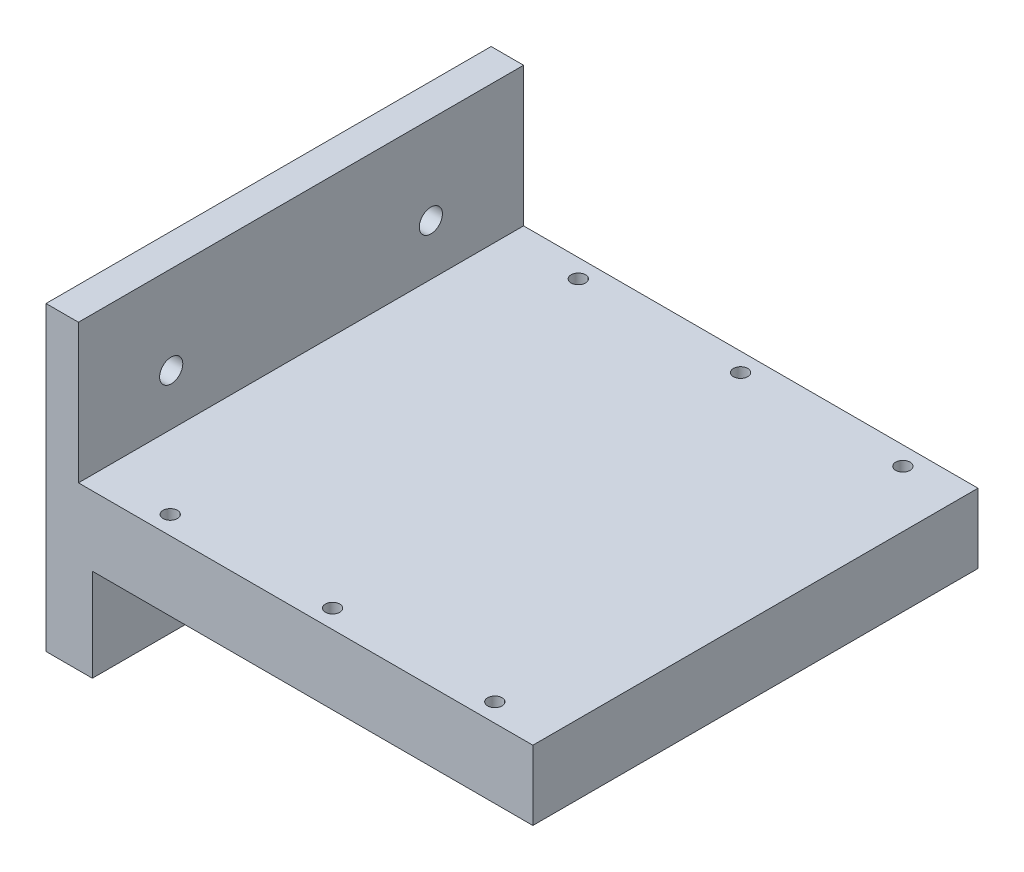
ISO-10303-21;
HEADER;
FILE_DESCRIPTION(('STEP AP214'),'2;1');
FILE_NAME('part.step','',(''),(''),'','','');
FILE_SCHEMA(('AUTOMOTIVE_DESIGN { 1 0 10303 214 1 1 1 1 }'));
ENDSEC;
DATA;
#1=APPLICATION_CONTEXT('core data for automotive mechanical design processes');
#2=APPLICATION_PROTOCOL_DEFINITION('international standard','automotive_design',2000,#1);
#3=PRODUCT_CONTEXT('',#1,'mechanical');
#4=PRODUCT('Part','Part','',(#3));
#5=PRODUCT_RELATED_PRODUCT_CATEGORY('part','',(#4));
#6=PRODUCT_DEFINITION_FORMATION('','',#4);
#7=PRODUCT_DEFINITION_CONTEXT('part definition',#1,'design');
#8=PRODUCT_DEFINITION('design','',#6,#7);
#9=PRODUCT_DEFINITION_SHAPE('','',#8);
#10=(LENGTH_UNIT() NAMED_UNIT(*) SI_UNIT(.MILLI.,.METRE.));
#11=(NAMED_UNIT(*) PLANE_ANGLE_UNIT() SI_UNIT($,.RADIAN.));
#12=(NAMED_UNIT(*) SI_UNIT($,.STERADIAN.) SOLID_ANGLE_UNIT());
#13=UNCERTAINTY_MEASURE_WITH_UNIT(LENGTH_MEASURE(1.E-05),#10,'distance_accuracy_value','');
#14=(GEOMETRIC_REPRESENTATION_CONTEXT(3) GLOBAL_UNCERTAINTY_ASSIGNED_CONTEXT((#13)) GLOBAL_UNIT_ASSIGNED_CONTEXT((#10,
#11,#12)) REPRESENTATION_CONTEXT('',''));
#15=CARTESIAN_POINT('',(0.,0.,0.));
#16=DIRECTION('',(0.,0.,1.));
#17=DIRECTION('',(1.,0.,0.));
#18=AXIS2_PLACEMENT_3D('',#15,#16,#17);
#19=CARTESIAN_POINT('',(-52.5,-7.5,96.));
#20=DIRECTION('',(0.,1.,0.));
#21=DIRECTION('',(0.,0.,1.));
#22=AXIS2_PLACEMENT_3D('',#19,#20,#21);
#23=PLANE('',#22);
#24=CARTESIAN_POINT('',(-29.7,-7.5,4.));
#25=DIRECTION('',(0.,1.,0.));
#26=DIRECTION('',(0.,0.,1.));
#27=AXIS2_PLACEMENT_3D('',#24,#25,#26);
#28=CIRCLE('',#27,1.55);
#29=CARTESIAN_POINT('',(-29.7,-7.5,5.55));
#30=VERTEX_POINT('',#29);
#31=EDGE_CURVE('E141',#30,#30,#28,.T.);
#32=ORIENTED_EDGE('',*,*,#31,.T.);
#33=EDGE_LOOP('',(#32));
#34=FACE_BOUND('',#33,.T.);
#35=CARTESIAN_POINT('',(5.29999999999999,-7.5,92.));
#36=DIRECTION('',(0.,1.,0.));
#37=DIRECTION('',(0.,0.,1.));
#38=AXIS2_PLACEMENT_3D('',#35,#36,#37);
#39=CIRCLE('',#38,1.55);
#40=CARTESIAN_POINT('',(5.29999999999999,-7.5,93.55));
#41=VERTEX_POINT('',#40);
#42=EDGE_CURVE('E274',#41,#41,#39,.T.);
#43=ORIENTED_EDGE('',*,*,#42,.T.);
#44=EDGE_LOOP('',(#43));
#45=FACE_BOUND('',#44,.T.);
#46=CARTESIAN_POINT('',(5.29999999999999,-7.5,4.));
#47=DIRECTION('',(0.,1.,0.));
#48=DIRECTION('',(0.,0.,1.));
#49=AXIS2_PLACEMENT_3D('',#46,#47,#48);
#50=CIRCLE('',#49,1.55);
#51=CARTESIAN_POINT('',(5.29999999999999,-7.5,5.55));
#52=VERTEX_POINT('',#51);
#53=EDGE_CURVE('E271',#52,#52,#50,.T.);
#54=ORIENTED_EDGE('',*,*,#53,.T.);
#55=EDGE_LOOP('',(#54));
#56=FACE_BOUND('',#55,.T.);
#57=CARTESIAN_POINT('',(40.3,-7.5,4.));
#58=DIRECTION('',(0.,1.,0.));
#59=DIRECTION('',(0.,0.,1.));
#60=AXIS2_PLACEMENT_3D('',#57,#58,#59);
#61=CIRCLE('',#60,1.55);
#62=CARTESIAN_POINT('',(40.3,-7.5,5.55));
#63=VERTEX_POINT('',#62);
#64=EDGE_CURVE('E267',#63,#63,#61,.T.);
#65=ORIENTED_EDGE('',*,*,#64,.T.);
#66=EDGE_LOOP('',(#65));
#67=FACE_BOUND('',#66,.T.);
#68=CARTESIAN_POINT('',(-29.7,-7.5,92.));
#69=DIRECTION('',(0.,1.,0.));
#70=DIRECTION('',(0.,0.,1.));
#71=AXIS2_PLACEMENT_3D('',#68,#69,#70);
#72=CIRCLE('',#71,1.55);
#73=CARTESIAN_POINT('',(-29.7,-7.5,93.55));
#74=VERTEX_POINT('',#73);
#75=EDGE_CURVE('E263',#74,#74,#72,.T.);
#76=ORIENTED_EDGE('',*,*,#75,.T.);
#77=EDGE_LOOP('',(#76));
#78=FACE_BOUND('',#77,.T.);
#79=CARTESIAN_POINT('',(40.3,-7.5,92.));
#80=DIRECTION('',(0.,1.,0.));
#81=DIRECTION('',(0.,0.,1.));
#82=AXIS2_PLACEMENT_3D('',#79,#80,#81);
#83=CIRCLE('',#82,1.55);
#84=CARTESIAN_POINT('',(40.3,-7.5,93.55));
#85=VERTEX_POINT('',#84);
#86=EDGE_CURVE('E259',#85,#85,#83,.T.);
#87=ORIENTED_EDGE('',*,*,#86,.T.);
#88=EDGE_LOOP('',(#87));
#89=FACE_BOUND('',#88,.T.);
#90=DIRECTION('',(0.,0.,1.));
#91=VECTOR('',#90,1.);
#92=CARTESIAN_POINT('',(-42.5,-7.5,96.));
#93=LINE('',#92,#91);
#94=CARTESIAN_POINT('',(-42.5,-7.5,0.));
#95=VERTEX_POINT('',#94);
#96=CARTESIAN_POINT('',(-42.5,-7.5,96.));
#97=VERTEX_POINT('',#96);
#98=EDGE_CURVE('E60',#95,#97,#93,.T.);
#99=ORIENTED_EDGE('',*,*,#98,.F.);
#100=DIRECTION('',(1.,0.,0.));
#101=VECTOR('',#100,1.);
#102=CARTESIAN_POINT('',(-52.5,-7.5,0.));
#103=LINE('',#102,#101);
#104=CARTESIAN_POINT('',(52.5,-7.5,0.));
#105=VERTEX_POINT('',#104);
#106=EDGE_CURVE('E120',#95,#105,#103,.T.);
#107=ORIENTED_EDGE('',*,*,#106,.T.);
#108=DIRECTION('',(0.,0.,-1.));
#109=VECTOR('',#108,1.);
#110=CARTESIAN_POINT('',(52.5,-7.5,96.));
#111=LINE('',#110,#109);
#112=CARTESIAN_POINT('',(52.5,-7.5,96.));
#113=VERTEX_POINT('',#112);
#114=EDGE_CURVE('E52',#113,#105,#111,.T.);
#115=ORIENTED_EDGE('',*,*,#114,.F.);
#116=DIRECTION('',(1.,0.,0.));
#117=VECTOR('',#116,1.);
#118=CARTESIAN_POINT('',(-52.5,-7.5,96.));
#119=LINE('',#118,#117);
#120=EDGE_CURVE('E189',#97,#113,#119,.T.);
#121=ORIENTED_EDGE('',*,*,#120,.F.);
#122=EDGE_LOOP('',(#99,#107,#115,#121));
#123=FACE_BOUND('',#122,.T.);
#124=ADVANCED_FACE('F42',(#34,#45,#56,#67,#78,#89,#123),#23,.F.);
#125=CARTESIAN_POINT('',(-52.5,7.5,96.));
#126=DIRECTION('',(0.,-1.,0.));
#127=DIRECTION('',(0.,0.,-1.));
#128=AXIS2_PLACEMENT_3D('',#125,#126,#127);
#129=PLANE('',#128);
#130=CARTESIAN_POINT('',(-29.7,7.5,4.));
#131=DIRECTION('',(0.,1.,0.));
#132=DIRECTION('',(0.,0.,1.));
#133=AXIS2_PLACEMENT_3D('',#130,#131,#132);
#134=CIRCLE('',#133,1.55);
#135=CARTESIAN_POINT('',(-29.7,7.5,5.55));
#136=VERTEX_POINT('',#135);
#137=EDGE_CURVE('E239',#136,#136,#134,.T.);
#138=ORIENTED_EDGE('',*,*,#137,.F.);
#139=EDGE_LOOP('',(#138));
#140=FACE_BOUND('',#139,.T.);
#141=CARTESIAN_POINT('',(5.29999999999999,7.5,92.));
#142=DIRECTION('',(0.,1.,0.));
#143=DIRECTION('',(0.,0.,1.));
#144=AXIS2_PLACEMENT_3D('',#141,#142,#143);
#145=CIRCLE('',#144,1.55);
#146=CARTESIAN_POINT('',(5.29999999999999,7.5,93.55));
#147=VERTEX_POINT('',#146);
#148=EDGE_CURVE('E240',#147,#147,#145,.T.);
#149=ORIENTED_EDGE('',*,*,#148,.F.);
#150=EDGE_LOOP('',(#149));
#151=FACE_BOUND('',#150,.T.);
#152=CARTESIAN_POINT('',(5.29999999999999,7.5,4.));
#153=DIRECTION('',(0.,1.,0.));
#154=DIRECTION('',(0.,0.,1.));
#155=AXIS2_PLACEMENT_3D('',#152,#153,#154);
#156=CIRCLE('',#155,1.55);
#157=CARTESIAN_POINT('',(5.29999999999999,7.5,5.55));
#158=VERTEX_POINT('',#157);
#159=EDGE_CURVE('E244',#158,#158,#156,.T.);
#160=ORIENTED_EDGE('',*,*,#159,.F.);
#161=EDGE_LOOP('',(#160));
#162=FACE_BOUND('',#161,.T.);
#163=CARTESIAN_POINT('',(40.3,7.5,4.));
#164=DIRECTION('',(0.,1.,0.));
#165=DIRECTION('',(0.,0.,1.));
#166=AXIS2_PLACEMENT_3D('',#163,#164,#165);
#167=CIRCLE('',#166,1.55);
#168=CARTESIAN_POINT('',(40.3,7.5,5.55));
#169=VERTEX_POINT('',#168);
#170=EDGE_CURVE('E248',#169,#169,#167,.T.);
#171=ORIENTED_EDGE('',*,*,#170,.F.);
#172=EDGE_LOOP('',(#171));
#173=FACE_BOUND('',#172,.T.);
#174=CARTESIAN_POINT('',(-29.7,7.5,92.));
#175=DIRECTION('',(0.,1.,0.));
#176=DIRECTION('',(0.,0.,1.));
#177=AXIS2_PLACEMENT_3D('',#174,#175,#176);
#178=CIRCLE('',#177,1.55);
#179=CARTESIAN_POINT('',(-29.7,7.5,93.55));
#180=VERTEX_POINT('',#179);
#181=EDGE_CURVE('E235',#180,#180,#178,.T.);
#182=ORIENTED_EDGE('',*,*,#181,.F.);
#183=EDGE_LOOP('',(#182));
#184=FACE_BOUND('',#183,.T.);
#185=CARTESIAN_POINT('',(40.3,7.5,92.));
#186=DIRECTION('',(0.,1.,0.));
#187=DIRECTION('',(0.,0.,1.));
#188=AXIS2_PLACEMENT_3D('',#185,#186,#187);
#189=CIRCLE('',#188,1.55);
#190=CARTESIAN_POINT('',(40.3,7.5,93.55));
#191=VERTEX_POINT('',#190);
#192=EDGE_CURVE('E252',#191,#191,#189,.T.);
#193=ORIENTED_EDGE('',*,*,#192,.F.);
#194=EDGE_LOOP('',(#193));
#195=FACE_BOUND('',#194,.T.);
#196=DIRECTION('',(0.,0.,-1.));
#197=VECTOR('',#196,1.);
#198=CARTESIAN_POINT('',(-45.5,7.5,0.));
#199=LINE('',#198,#197);
#200=CARTESIAN_POINT('',(-45.5,7.5,96.));
#201=VERTEX_POINT('',#200);
#202=CARTESIAN_POINT('',(-45.5,7.5,0.));
#203=VERTEX_POINT('',#202);
#204=EDGE_CURVE('E68',#201,#203,#199,.T.);
#205=ORIENTED_EDGE('',*,*,#204,.F.);
#206=DIRECTION('',(-1.,0.,0.));
#207=VECTOR('',#206,1.);
#208=CARTESIAN_POINT('',(-52.5,7.5,96.));
#209=LINE('',#208,#207);
#210=CARTESIAN_POINT('',(52.5,7.5,96.));
#211=VERTEX_POINT('',#210);
#212=EDGE_CURVE('E183',#211,#201,#209,.T.);
#213=ORIENTED_EDGE('',*,*,#212,.F.);
#214=DIRECTION('',(0.,0.,-1.));
#215=VECTOR('',#214,1.);
#216=CARTESIAN_POINT('',(52.5,7.5,96.));
#217=LINE('',#216,#215);
#218=CARTESIAN_POINT('',(52.5,7.5,0.));
#219=VERTEX_POINT('',#218);
#220=EDGE_CURVE('E11',#211,#219,#217,.T.);
#221=ORIENTED_EDGE('',*,*,#220,.T.);
#222=DIRECTION('',(-1.,0.,0.));
#223=VECTOR('',#222,1.);
#224=CARTESIAN_POINT('',(-52.5,7.5,0.));
#225=LINE('',#224,#223);
#226=EDGE_CURVE('E121',#219,#203,#225,.T.);
#227=ORIENTED_EDGE('',*,*,#226,.T.);
#228=EDGE_LOOP('',(#205,#213,#221,#227));
#229=FACE_BOUND('',#228,.T.);
#230=ADVANCED_FACE('F302',(#140,#151,#162,#173,#184,#195,#229),#129,.F.);
#231=CARTESIAN_POINT('',(52.5,-7.5,96.));
#232=DIRECTION('',(-1.,0.,0.));
#233=DIRECTION('',(0.,0.,1.));
#234=AXIS2_PLACEMENT_3D('',#231,#232,#233);
#235=PLANE('',#234);
#236=DIRECTION('',(0.,1.,0.));
#237=VECTOR('',#236,1.);
#238=CARTESIAN_POINT('',(52.5,-7.5,0.));
#239=LINE('',#238,#237);
#240=EDGE_CURVE('E178',#105,#219,#239,.T.);
#241=ORIENTED_EDGE('',*,*,#240,.T.);
#242=ORIENTED_EDGE('',*,*,#220,.F.);
#243=DIRECTION('',(0.,1.,0.));
#244=VECTOR('',#243,1.);
#245=CARTESIAN_POINT('',(52.5,-7.5,96.));
#246=LINE('',#245,#244);
#247=EDGE_CURVE('E179',#113,#211,#246,.T.);
#248=ORIENTED_EDGE('',*,*,#247,.F.);
#249=ORIENTED_EDGE('',*,*,#114,.T.);
#250=EDGE_LOOP('',(#241,#242,#248,#249));
#251=FACE_BOUND('',#250,.T.);
#252=ADVANCED_FACE('F44',(#251),#235,.F.);
#253=CARTESIAN_POINT('',(-52.5,-7.5,96.));
#254=DIRECTION('',(1.,0.,0.));
#255=DIRECTION('',(0.,0.,-1.));
#256=AXIS2_PLACEMENT_3D('',#253,#254,#255);
#257=PLANE('',#256);
#258=CARTESIAN_POINT('',(-52.5,18.5,76.));
#259=DIRECTION('',(1.,0.,0.));
#260=DIRECTION('',(0.,0.,-1.));
#261=AXIS2_PLACEMENT_3D('',#258,#259,#260);
#262=CIRCLE('',#261,2.50000000000001);
#263=CARTESIAN_POINT('',(-52.5,18.5,73.5));
#264=VERTEX_POINT('',#263);
#265=EDGE_CURVE('E214',#264,#264,#262,.F.);
#266=ORIENTED_EDGE('',*,*,#265,.F.);
#267=EDGE_LOOP('',(#266));
#268=FACE_BOUND('',#267,.T.);
#269=CARTESIAN_POINT('',(-52.5,18.5,20.));
#270=DIRECTION('',(1.,0.,0.));
#271=DIRECTION('',(0.,0.,-1.));
#272=AXIS2_PLACEMENT_3D('',#269,#270,#271);
#273=CIRCLE('',#272,2.5);
#274=CARTESIAN_POINT('',(-52.5,18.5,17.5));
#275=VERTEX_POINT('',#274);
#276=EDGE_CURVE('E204',#275,#275,#273,.F.);
#277=ORIENTED_EDGE('',*,*,#276,.F.);
#278=EDGE_LOOP('',(#277));
#279=FACE_BOUND('',#278,.T.);
#280=CARTESIAN_POINT('',(-52.5,-19.5,76.));
#281=DIRECTION('',(1.,0.,0.));
#282=DIRECTION('',(0.,0.,-1.));
#283=AXIS2_PLACEMENT_3D('',#280,#281,#282);
#284=CIRCLE('',#283,2.50000000000001);
#285=CARTESIAN_POINT('',(-52.5,-19.5,73.5));
#286=VERTEX_POINT('',#285);
#287=EDGE_CURVE('E231',#286,#286,#284,.T.);
#288=ORIENTED_EDGE('',*,*,#287,.T.);
#289=EDGE_LOOP('',(#288));
#290=FACE_BOUND('',#289,.T.);
#291=CARTESIAN_POINT('',(-52.5,-19.5,20.));
#292=DIRECTION('',(1.,0.,0.));
#293=DIRECTION('',(0.,0.,-1.));
#294=AXIS2_PLACEMENT_3D('',#291,#292,#293);
#295=CIRCLE('',#294,2.5);
#296=CARTESIAN_POINT('',(-52.5,-19.5,17.5));
#297=VERTEX_POINT('',#296);
#298=EDGE_CURVE('E224',#297,#297,#295,.T.);
#299=ORIENTED_EDGE('',*,*,#298,.T.);
#300=EDGE_LOOP('',(#299));
#301=FACE_BOUND('',#300,.T.);
#302=DIRECTION('',(0.,-1.,0.));
#303=VECTOR('',#302,1.);
#304=CARTESIAN_POINT('',(-52.5,-7.5,0.));
#305=LINE('',#304,#303);
#306=CARTESIAN_POINT('',(-52.5,37.5,0.));
#307=VERTEX_POINT('',#306);
#308=CARTESIAN_POINT('',(-52.5,-27.5,0.));
#309=VERTEX_POINT('',#308);
#310=EDGE_CURVE('E110',#307,#309,#305,.T.);
#311=ORIENTED_EDGE('',*,*,#310,.T.);
#312=DIRECTION('',(0.,0.,-1.));
#313=VECTOR('',#312,1.);
#314=CARTESIAN_POINT('',(-52.5,-27.5,96.));
#315=LINE('',#314,#313);
#316=CARTESIAN_POINT('',(-52.5,-27.5,96.));
#317=VERTEX_POINT('',#316);
#318=EDGE_CURVE('E114',#317,#309,#315,.T.);
#319=ORIENTED_EDGE('',*,*,#318,.F.);
#320=DIRECTION('',(0.,-1.,0.));
#321=VECTOR('',#320,1.);
#322=CARTESIAN_POINT('',(-52.5,-7.5,96.));
#323=LINE('',#322,#321);
#324=CARTESIAN_POINT('',(-52.5,37.5,96.));
#325=VERTEX_POINT('',#324);
#326=EDGE_CURVE('E186',#325,#317,#323,.T.);
#327=ORIENTED_EDGE('',*,*,#326,.F.);
#328=DIRECTION('',(0.,0.,1.));
#329=VECTOR('',#328,1.);
#330=CARTESIAN_POINT('',(-52.5,37.5,0.));
#331=LINE('',#330,#329);
#332=EDGE_CURVE('E116',#307,#325,#331,.T.);
#333=ORIENTED_EDGE('',*,*,#332,.F.);
#334=EDGE_LOOP('',(#311,#319,#327,#333));
#335=FACE_BOUND('',#334,.T.);
#336=ADVANCED_FACE('F112',(#268,#279,#290,#301,#335),#257,.F.);
#337=CARTESIAN_POINT('',(0.,0.,96.));
#338=DIRECTION('',(0.,0.,-1.));
#339=DIRECTION('',(-1.,0.,0.));
#340=AXIS2_PLACEMENT_3D('',#337,#338,#339);
#341=PLANE('',#340);
#342=ORIENTED_EDGE('',*,*,#247,.T.);
#343=ORIENTED_EDGE('',*,*,#212,.T.);
#344=DIRECTION('',(0.,-1.,0.));
#345=VECTOR('',#344,1.);
#346=CARTESIAN_POINT('',(-45.5,37.5,96.));
#347=LINE('',#346,#345);
#348=CARTESIAN_POINT('',(-45.5,37.5,96.));
#349=VERTEX_POINT('',#348);
#350=EDGE_CURVE('E168',#349,#201,#347,.T.);
#351=ORIENTED_EDGE('',*,*,#350,.F.);
#352=DIRECTION('',(1.,0.,0.));
#353=VECTOR('',#352,1.);
#354=CARTESIAN_POINT('',(-45.5,37.5,96.));
#355=LINE('',#354,#353);
#356=EDGE_CURVE('E165',#325,#349,#355,.T.);
#357=ORIENTED_EDGE('',*,*,#356,.F.);
#358=ORIENTED_EDGE('',*,*,#326,.T.);
#359=DIRECTION('',(-1.,0.,0.));
#360=VECTOR('',#359,1.);
#361=CARTESIAN_POINT('',(-52.5,-27.5,96.));
#362=LINE('',#361,#360);
#363=CARTESIAN_POINT('',(-42.5,-27.5,96.));
#364=VERTEX_POINT('',#363);
#365=EDGE_CURVE('E137',#364,#317,#362,.T.);
#366=ORIENTED_EDGE('',*,*,#365,.F.);
#367=DIRECTION('',(0.,1.,0.));
#368=VECTOR('',#367,1.);
#369=CARTESIAN_POINT('',(-42.5,-27.5,96.));
#370=LINE('',#369,#368);
#371=EDGE_CURVE('E149',#364,#97,#370,.T.);
#372=ORIENTED_EDGE('',*,*,#371,.T.);
#373=ORIENTED_EDGE('',*,*,#120,.T.);
#374=EDGE_LOOP('',(#342,#343,#351,#357,#358,#366,#372,#373));
#375=FACE_BOUND('',#374,.T.);
#376=ADVANCED_FACE('F312',(#375),#341,.F.);
#377=CARTESIAN_POINT('',(0.,0.,0.));
#378=DIRECTION('',(0.,0.,-1.));
#379=DIRECTION('',(-1.,0.,0.));
#380=AXIS2_PLACEMENT_3D('',#377,#378,#379);
#381=PLANE('',#380);
#382=ORIENTED_EDGE('',*,*,#240,.F.);
#383=ORIENTED_EDGE('',*,*,#106,.F.);
#384=DIRECTION('',(0.,1.,0.));
#385=VECTOR('',#384,1.);
#386=CARTESIAN_POINT('',(-42.5,-27.5,0.));
#387=LINE('',#386,#385);
#388=CARTESIAN_POINT('',(-42.5,-27.5,0.));
#389=VERTEX_POINT('',#388);
#390=EDGE_CURVE('E128',#389,#95,#387,.T.);
#391=ORIENTED_EDGE('',*,*,#390,.F.);
#392=DIRECTION('',(1.,0.,0.));
#393=VECTOR('',#392,1.);
#394=CARTESIAN_POINT('',(-52.5,-27.5,0.));
#395=LINE('',#394,#393);
#396=EDGE_CURVE('E124',#309,#389,#395,.T.);
#397=ORIENTED_EDGE('',*,*,#396,.F.);
#398=ORIENTED_EDGE('',*,*,#310,.F.);
#399=DIRECTION('',(-1.,0.,0.));
#400=VECTOR('',#399,1.);
#401=CARTESIAN_POINT('',(-45.5,37.5,0.));
#402=LINE('',#401,#400);
#403=CARTESIAN_POINT('',(-45.5,37.5,0.));
#404=VERTEX_POINT('',#403);
#405=EDGE_CURVE('E160',#404,#307,#402,.T.);
#406=ORIENTED_EDGE('',*,*,#405,.F.);
#407=DIRECTION('',(0.,-1.,0.));
#408=VECTOR('',#407,1.);
#409=CARTESIAN_POINT('',(-45.5,37.5,0.));
#410=LINE('',#409,#408);
#411=EDGE_CURVE('E174',#404,#203,#410,.T.);
#412=ORIENTED_EDGE('',*,*,#411,.T.);
#413=ORIENTED_EDGE('',*,*,#226,.F.);
#414=EDGE_LOOP('',(#382,#383,#391,#397,#398,#406,#412,#413));
#415=FACE_BOUND('',#414,.T.);
#416=ADVANCED_FACE('F126',(#415),#381,.T.);
#417=CARTESIAN_POINT('',(-45.5,37.5,0.));
#418=DIRECTION('',(-1.,0.,0.));
#419=DIRECTION('',(0.,0.,1.));
#420=AXIS2_PLACEMENT_3D('',#417,#418,#419);
#421=PLANE('',#420);
#422=CARTESIAN_POINT('',(-45.5,18.5,76.));
#423=DIRECTION('',(-1.,0.,0.));
#424=DIRECTION('',(0.,0.,1.));
#425=AXIS2_PLACEMENT_3D('',#422,#423,#424);
#426=CIRCLE('',#425,2.50000000000001);
#427=CARTESIAN_POINT('',(-45.5,18.5,78.5));
#428=VERTEX_POINT('',#427);
#429=EDGE_CURVE('E46',#428,#428,#426,.F.);
#430=ORIENTED_EDGE('',*,*,#429,.F.);
#431=EDGE_LOOP('',(#430));
#432=FACE_BOUND('',#431,.T.);
#433=CARTESIAN_POINT('',(-45.5,18.5,20.));
#434=DIRECTION('',(-1.,0.,0.));
#435=DIRECTION('',(0.,0.,1.));
#436=AXIS2_PLACEMENT_3D('',#433,#434,#435);
#437=CIRCLE('',#436,2.5);
#438=CARTESIAN_POINT('',(-45.5,18.5,22.5));
#439=VERTEX_POINT('',#438);
#440=EDGE_CURVE('E201',#439,#439,#437,.F.);
#441=ORIENTED_EDGE('',*,*,#440,.F.);
#442=EDGE_LOOP('',(#441));
#443=FACE_BOUND('',#442,.T.);
#444=ORIENTED_EDGE('',*,*,#204,.T.);
#445=ORIENTED_EDGE('',*,*,#411,.F.);
#446=DIRECTION('',(0.,0.,-1.));
#447=VECTOR('',#446,1.);
#448=CARTESIAN_POINT('',(-45.5,37.5,0.));
#449=LINE('',#448,#447);
#450=EDGE_CURVE('E156',#349,#404,#449,.T.);
#451=ORIENTED_EDGE('',*,*,#450,.F.);
#452=ORIENTED_EDGE('',*,*,#350,.T.);
#453=EDGE_LOOP('',(#444,#445,#451,#452));
#454=FACE_BOUND('',#453,.T.);
#455=ADVANCED_FACE('F374',(#432,#443,#454),#421,.F.);
#456=CARTESIAN_POINT('',(0.,37.5,0.));
#457=DIRECTION('',(0.,-1.,0.));
#458=DIRECTION('',(0.,0.,-1.));
#459=AXIS2_PLACEMENT_3D('',#456,#457,#458);
#460=PLANE('',#459);
#461=ORIENTED_EDGE('',*,*,#450,.T.);
#462=ORIENTED_EDGE('',*,*,#405,.T.);
#463=ORIENTED_EDGE('',*,*,#332,.T.);
#464=ORIENTED_EDGE('',*,*,#356,.T.);
#465=EDGE_LOOP('',(#461,#462,#463,#464));
#466=FACE_BOUND('',#465,.T.);
#467=ADVANCED_FACE('F370',(#466),#460,.F.);
#468=CARTESIAN_POINT('',(-42.5,-27.5,96.));
#469=DIRECTION('',(-1.,0.,0.));
#470=DIRECTION('',(0.,0.,1.));
#471=AXIS2_PLACEMENT_3D('',#468,#469,#470);
#472=PLANE('',#471);
#473=CARTESIAN_POINT('',(-42.5,-19.5,76.));
#474=DIRECTION('',(1.,0.,0.));
#475=DIRECTION('',(0.,0.,-1.));
#476=AXIS2_PLACEMENT_3D('',#473,#474,#475);
#477=CIRCLE('',#476,2.50000000000001);
#478=CARTESIAN_POINT('',(-42.5,-19.5,73.5));
#479=VERTEX_POINT('',#478);
#480=EDGE_CURVE('E220',#479,#479,#477,.T.);
#481=ORIENTED_EDGE('',*,*,#480,.F.);
#482=EDGE_LOOP('',(#481));
#483=FACE_BOUND('',#482,.T.);
#484=CARTESIAN_POINT('',(-42.5,-19.5,20.));
#485=DIRECTION('',(1.,0.,0.));
#486=DIRECTION('',(0.,0.,-1.));
#487=AXIS2_PLACEMENT_3D('',#484,#485,#486);
#488=CIRCLE('',#487,2.5);
#489=CARTESIAN_POINT('',(-42.5,-19.5,17.5));
#490=VERTEX_POINT('',#489);
#491=EDGE_CURVE('E219',#490,#490,#488,.T.);
#492=ORIENTED_EDGE('',*,*,#491,.F.);
#493=EDGE_LOOP('',(#492));
#494=FACE_BOUND('',#493,.T.);
#495=ORIENTED_EDGE('',*,*,#98,.T.);
#496=ORIENTED_EDGE('',*,*,#371,.F.);
#497=DIRECTION('',(0.,0.,1.));
#498=VECTOR('',#497,1.);
#499=CARTESIAN_POINT('',(-42.5,-27.5,96.));
#500=LINE('',#499,#498);
#501=EDGE_CURVE('E132',#389,#364,#500,.T.);
#502=ORIENTED_EDGE('',*,*,#501,.F.);
#503=ORIENTED_EDGE('',*,*,#390,.T.);
#504=EDGE_LOOP('',(#495,#496,#502,#503));
#505=FACE_BOUND('',#504,.T.);
#506=ADVANCED_FACE('F364',(#483,#494,#505),#472,.F.);
#507=CARTESIAN_POINT('',(0.,-27.5,0.));
#508=DIRECTION('',(0.,-1.,0.));
#509=DIRECTION('',(0.,0.,-1.));
#510=AXIS2_PLACEMENT_3D('',#507,#508,#509);
#511=PLANE('',#510);
#512=ORIENTED_EDGE('',*,*,#318,.T.);
#513=ORIENTED_EDGE('',*,*,#396,.T.);
#514=ORIENTED_EDGE('',*,*,#501,.T.);
#515=ORIENTED_EDGE('',*,*,#365,.T.);
#516=EDGE_LOOP('',(#512,#513,#514,#515));
#517=FACE_BOUND('',#516,.T.);
#518=ADVANCED_FACE('F135',(#517),#511,.T.);
#519=CARTESIAN_POINT('',(40.3,-12.5,92.));
#520=DIRECTION('',(0.,1.,0.));
#521=DIRECTION('',(0.,0.,1.));
#522=AXIS2_PLACEMENT_3D('',#519,#520,#521);
#523=CYLINDRICAL_SURFACE('',#522,1.55);
#524=ORIENTED_EDGE('',*,*,#192,.T.);
#525=EDGE_LOOP('',(#524));
#526=FACE_BOUND('',#525,.T.);
#527=ORIENTED_EDGE('',*,*,#86,.F.);
#528=EDGE_LOOP('',(#527));
#529=FACE_BOUND('',#528,.T.);
#530=ADVANCED_FACE('F342',(#526,#529),#523,.F.);
#531=CARTESIAN_POINT('',(-29.7,-12.5,92.));
#532=DIRECTION('',(0.,1.,0.));
#533=DIRECTION('',(0.,0.,1.));
#534=AXIS2_PLACEMENT_3D('',#531,#532,#533);
#535=CYLINDRICAL_SURFACE('',#534,1.55);
#536=ORIENTED_EDGE('',*,*,#181,.T.);
#537=EDGE_LOOP('',(#536));
#538=FACE_BOUND('',#537,.T.);
#539=ORIENTED_EDGE('',*,*,#75,.F.);
#540=EDGE_LOOP('',(#539));
#541=FACE_BOUND('',#540,.T.);
#542=ADVANCED_FACE('F339',(#538,#541),#535,.F.);
#543=CARTESIAN_POINT('',(40.3,-12.5,4.));
#544=DIRECTION('',(0.,1.,0.));
#545=DIRECTION('',(0.,0.,1.));
#546=AXIS2_PLACEMENT_3D('',#543,#544,#545);
#547=CYLINDRICAL_SURFACE('',#546,1.55);
#548=ORIENTED_EDGE('',*,*,#170,.T.);
#549=EDGE_LOOP('',(#548));
#550=FACE_BOUND('',#549,.T.);
#551=ORIENTED_EDGE('',*,*,#64,.F.);
#552=EDGE_LOOP('',(#551));
#553=FACE_BOUND('',#552,.T.);
#554=ADVANCED_FACE('F341',(#550,#553),#547,.F.);
#555=CARTESIAN_POINT('',(5.29999999999999,-12.5,4.));
#556=DIRECTION('',(0.,1.,0.));
#557=DIRECTION('',(0.,0.,1.));
#558=AXIS2_PLACEMENT_3D('',#555,#556,#557);
#559=CYLINDRICAL_SURFACE('',#558,1.55);
#560=ORIENTED_EDGE('',*,*,#159,.T.);
#561=EDGE_LOOP('',(#560));
#562=FACE_BOUND('',#561,.T.);
#563=ORIENTED_EDGE('',*,*,#53,.F.);
#564=EDGE_LOOP('',(#563));
#565=FACE_BOUND('',#564,.T.);
#566=ADVANCED_FACE('F297',(#562,#565),#559,.F.);
#567=CARTESIAN_POINT('',(5.29999999999999,-12.5,92.));
#568=DIRECTION('',(0.,1.,0.));
#569=DIRECTION('',(0.,0.,1.));
#570=AXIS2_PLACEMENT_3D('',#567,#568,#569);
#571=CYLINDRICAL_SURFACE('',#570,1.55);
#572=ORIENTED_EDGE('',*,*,#148,.T.);
#573=EDGE_LOOP('',(#572));
#574=FACE_BOUND('',#573,.T.);
#575=ORIENTED_EDGE('',*,*,#42,.F.);
#576=EDGE_LOOP('',(#575));
#577=FACE_BOUND('',#576,.T.);
#578=ADVANCED_FACE('F287',(#574,#577),#571,.F.);
#579=CARTESIAN_POINT('',(-29.7,-12.5,4.));
#580=DIRECTION('',(0.,1.,0.));
#581=DIRECTION('',(0.,0.,1.));
#582=AXIS2_PLACEMENT_3D('',#579,#580,#581);
#583=CYLINDRICAL_SURFACE('',#582,1.55);
#584=ORIENTED_EDGE('',*,*,#137,.T.);
#585=EDGE_LOOP('',(#584));
#586=FACE_BOUND('',#585,.T.);
#587=ORIENTED_EDGE('',*,*,#31,.F.);
#588=EDGE_LOOP('',(#587));
#589=FACE_BOUND('',#588,.T.);
#590=ADVANCED_FACE('F284',(#586,#589),#583,.F.);
#591=CARTESIAN_POINT('',(-62.5,-19.5,20.));
#592=DIRECTION('',(1.,0.,0.));
#593=DIRECTION('',(0.,0.,-1.));
#594=AXIS2_PLACEMENT_3D('',#591,#592,#593);
#595=CYLINDRICAL_SURFACE('',#594,2.5);
#596=ORIENTED_EDGE('',*,*,#491,.T.);
#597=EDGE_LOOP('',(#596));
#598=FACE_BOUND('',#597,.T.);
#599=ORIENTED_EDGE('',*,*,#298,.F.);
#600=EDGE_LOOP('',(#599));
#601=FACE_BOUND('',#600,.T.);
#602=ADVANCED_FACE('F286',(#598,#601),#595,.F.);
#603=CARTESIAN_POINT('',(-62.5,-19.5,76.));
#604=DIRECTION('',(1.,0.,0.));
#605=DIRECTION('',(0.,0.,-1.));
#606=AXIS2_PLACEMENT_3D('',#603,#604,#605);
#607=CYLINDRICAL_SURFACE('',#606,2.50000000000001);
#608=ORIENTED_EDGE('',*,*,#480,.T.);
#609=EDGE_LOOP('',(#608));
#610=FACE_BOUND('',#609,.T.);
#611=ORIENTED_EDGE('',*,*,#287,.F.);
#612=EDGE_LOOP('',(#611));
#613=FACE_BOUND('',#612,.T.);
#614=ADVANCED_FACE('F294',(#610,#613),#607,.F.);
#615=CARTESIAN_POINT('',(-62.5,18.5,20.));
#616=DIRECTION('',(1.,0.,0.));
#617=DIRECTION('',(0.,0.,-1.));
#618=AXIS2_PLACEMENT_3D('',#615,#616,#617);
#619=CYLINDRICAL_SURFACE('',#618,2.5);
#620=ORIENTED_EDGE('',*,*,#440,.T.);
#621=EDGE_LOOP('',(#620));
#622=FACE_BOUND('',#621,.T.);
#623=ORIENTED_EDGE('',*,*,#276,.T.);
#624=EDGE_LOOP('',(#623));
#625=FACE_BOUND('',#624,.T.);
#626=ADVANCED_FACE('F329',(#622,#625),#619,.F.);
#627=CARTESIAN_POINT('',(-62.5,18.5,76.));
#628=DIRECTION('',(1.,0.,0.));
#629=DIRECTION('',(0.,0.,-1.));
#630=AXIS2_PLACEMENT_3D('',#627,#628,#629);
#631=CYLINDRICAL_SURFACE('',#630,2.50000000000001);
#632=ORIENTED_EDGE('',*,*,#429,.T.);
#633=EDGE_LOOP('',(#632));
#634=FACE_BOUND('',#633,.T.);
#635=ORIENTED_EDGE('',*,*,#265,.T.);
#636=EDGE_LOOP('',(#635));
#637=FACE_BOUND('',#636,.T.);
#638=ADVANCED_FACE('F335',(#634,#637),#631,.F.);
#639=CLOSED_SHELL('',(#124,#230,#252,#336,#376,#416,#455,#467,#506,#518,#530,#542,#554,#566,
#578,#590,#602,#614,#626,#638));
#640=MANIFOLD_SOLID_BREP('B2',#639);
#641=ADVANCED_BREP_SHAPE_REPRESENTATION('',(#18,#640),#14);
#642=SHAPE_DEFINITION_REPRESENTATION(#9,#641);
ENDSEC;
END-ISO-10303-21;
